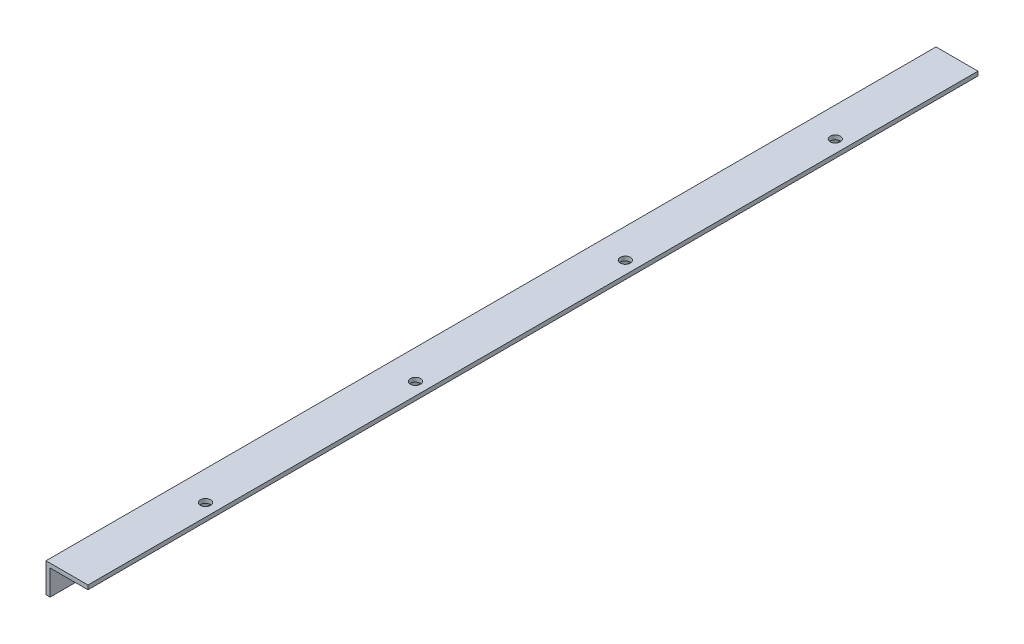
ISO-10303-21;
HEADER;
FILE_DESCRIPTION(('STEP AP214'),'2;1');
FILE_NAME('part.step','',(''),(''),'','','');
FILE_SCHEMA(('AUTOMOTIVE_DESIGN { 1 0 10303 214 1 1 1 1 }'));
ENDSEC;
DATA;
#1=APPLICATION_CONTEXT('core data for automotive mechanical design processes');
#2=APPLICATION_PROTOCOL_DEFINITION('international standard','automotive_design',2000,#1);
#3=PRODUCT_CONTEXT('',#1,'mechanical');
#4=PRODUCT('Part','Part','',(#3));
#5=PRODUCT_RELATED_PRODUCT_CATEGORY('part','',(#4));
#6=PRODUCT_DEFINITION_FORMATION('','',#4);
#7=PRODUCT_DEFINITION_CONTEXT('part definition',#1,'design');
#8=PRODUCT_DEFINITION('design','',#6,#7);
#9=PRODUCT_DEFINITION_SHAPE('','',#8);
#10=(LENGTH_UNIT() NAMED_UNIT(*) SI_UNIT(.MILLI.,.METRE.));
#11=(NAMED_UNIT(*) PLANE_ANGLE_UNIT() SI_UNIT($,.RADIAN.));
#12=(NAMED_UNIT(*) SI_UNIT($,.STERADIAN.) SOLID_ANGLE_UNIT());
#13=UNCERTAINTY_MEASURE_WITH_UNIT(LENGTH_MEASURE(1.E-05),#10,'distance_accuracy_value','');
#14=(GEOMETRIC_REPRESENTATION_CONTEXT(3) GLOBAL_UNCERTAINTY_ASSIGNED_CONTEXT((#13)) GLOBAL_UNIT_ASSIGNED_CONTEXT((#10,
#11,#12)) REPRESENTATION_CONTEXT('',''));
#15=CARTESIAN_POINT('',(0.,0.,0.));
#16=DIRECTION('',(0.,0.,1.));
#17=DIRECTION('',(1.,0.,0.));
#18=AXIS2_PLACEMENT_3D('',#15,#16,#17);
#19=CARTESIAN_POINT('',(1.,0.,212.));
#20=DIRECTION('',(0.,1.,0.));
#21=DIRECTION('',(-1.,0.,0.));
#22=AXIS2_PLACEMENT_3D('',#19,#20,#21);
#23=PLANE('',#22);
#24=DIRECTION('',(1.,0.,0.));
#25=VECTOR('',#24,1.);
#26=CARTESIAN_POINT('',(1.,0.,0.));
#27=LINE('',#26,#25);
#28=CARTESIAN_POINT('',(0.,0.,0.));
#29=VERTEX_POINT('',#28);
#30=CARTESIAN_POINT('',(1.,0.,0.));
#31=VERTEX_POINT('',#30);
#32=EDGE_CURVE('E118',#29,#31,#27,.T.);
#33=ORIENTED_EDGE('',*,*,#32,.T.);
#34=DIRECTION('',(0.,0.,-1.));
#35=VECTOR('',#34,1.);
#36=CARTESIAN_POINT('',(1.,0.,212.));
#37=LINE('',#36,#35);
#38=CARTESIAN_POINT('',(1.,0.,212.));
#39=VERTEX_POINT('',#38);
#40=EDGE_CURVE('E11',#39,#31,#37,.T.);
#41=ORIENTED_EDGE('',*,*,#40,.F.);
#42=DIRECTION('',(1.,0.,0.));
#43=VECTOR('',#42,1.);
#44=CARTESIAN_POINT('',(1.,0.,212.));
#45=LINE('',#44,#43);
#46=CARTESIAN_POINT('',(0.,0.,212.));
#47=VERTEX_POINT('',#46);
#48=EDGE_CURVE('E129',#47,#39,#45,.T.);
#49=ORIENTED_EDGE('',*,*,#48,.F.);
#50=DIRECTION('',(0.,0.,-1.));
#51=VECTOR('',#50,1.);
#52=CARTESIAN_POINT('',(0.,0.,212.));
#53=LINE('',#52,#51);
#54=EDGE_CURVE('E114',#47,#29,#53,.T.);
#55=ORIENTED_EDGE('',*,*,#54,.T.);
#56=EDGE_LOOP('',(#33,#41,#49,#55));
#57=FACE_BOUND('',#56,.T.);
#58=ADVANCED_FACE('F34',(#57),#23,.F.);
#59=CARTESIAN_POINT('',(1.,6.,212.));
#60=DIRECTION('',(-1.,0.,0.));
#61=DIRECTION('',(0.,-1.,0.));
#62=AXIS2_PLACEMENT_3D('',#59,#60,#61);
#63=PLANE('',#62);
#64=DIRECTION('',(0.,1.,0.));
#65=VECTOR('',#64,1.);
#66=CARTESIAN_POINT('',(1.,6.,0.));
#67=LINE('',#66,#65);
#68=CARTESIAN_POINT('',(1.,6.,0.));
#69=VERTEX_POINT('',#68);
#70=EDGE_CURVE('E121',#31,#69,#67,.T.);
#71=ORIENTED_EDGE('',*,*,#70,.T.);
#72=DIRECTION('',(0.,0.,-1.));
#73=VECTOR('',#72,1.);
#74=CARTESIAN_POINT('',(1.,6.,212.));
#75=LINE('',#74,#73);
#76=CARTESIAN_POINT('',(1.,6.,212.));
#77=VERTEX_POINT('',#76);
#78=EDGE_CURVE('E42',#77,#69,#75,.T.);
#79=ORIENTED_EDGE('',*,*,#78,.F.);
#80=DIRECTION('',(0.,1.,0.));
#81=VECTOR('',#80,1.);
#82=CARTESIAN_POINT('',(1.,6.,212.));
#83=LINE('',#82,#81);
#84=EDGE_CURVE('E87',#39,#77,#83,.T.);
#85=ORIENTED_EDGE('',*,*,#84,.F.);
#86=ORIENTED_EDGE('',*,*,#40,.T.);
#87=EDGE_LOOP('',(#71,#79,#85,#86));
#88=FACE_BOUND('',#87,.T.);
#89=ADVANCED_FACE('F154',(#88),#63,.F.);
#90=CARTESIAN_POINT('',(10.,6.,212.));
#91=DIRECTION('',(0.,1.,0.));
#92=DIRECTION('',(-1.,0.,0.));
#93=AXIS2_PLACEMENT_3D('',#90,#91,#92);
#94=PLANE('',#93);
#95=CARTESIAN_POINT('',(7.,6.,131.));
#96=DIRECTION('',(0.,1.,0.));
#97=DIRECTION('',(-1.,0.,0.));
#98=AXIS2_PLACEMENT_3D('',#95,#96,#97);
#99=CIRCLE('',#98,1.2);
#100=CARTESIAN_POINT('',(5.8,6.,131.));
#101=VERTEX_POINT('',#100);
#102=EDGE_CURVE('E242',#101,#101,#99,.T.);
#103=ORIENTED_EDGE('',*,*,#102,.T.);
#104=EDGE_LOOP('',(#103));
#105=FACE_BOUND('',#104,.T.);
#106=CARTESIAN_POINT('',(7.,6.,81.));
#107=DIRECTION('',(0.,1.,0.));
#108=DIRECTION('',(-1.,0.,0.));
#109=AXIS2_PLACEMENT_3D('',#106,#107,#108);
#110=CIRCLE('',#109,1.2);
#111=CARTESIAN_POINT('',(5.8,6.,81.));
#112=VERTEX_POINT('',#111);
#113=EDGE_CURVE('E246',#112,#112,#110,.T.);
#114=ORIENTED_EDGE('',*,*,#113,.T.);
#115=EDGE_LOOP('',(#114));
#116=FACE_BOUND('',#115,.T.);
#117=CARTESIAN_POINT('',(7.,6.,31.));
#118=DIRECTION('',(0.,1.,0.));
#119=DIRECTION('',(-1.,0.,0.));
#120=AXIS2_PLACEMENT_3D('',#117,#118,#119);
#121=CIRCLE('',#120,1.2);
#122=CARTESIAN_POINT('',(5.8,6.,31.));
#123=VERTEX_POINT('',#122);
#124=EDGE_CURVE('E255',#123,#123,#121,.T.);
#125=ORIENTED_EDGE('',*,*,#124,.T.);
#126=EDGE_LOOP('',(#125));
#127=FACE_BOUND('',#126,.T.);
#128=CARTESIAN_POINT('',(7.,6.,181.));
#129=DIRECTION('',(0.,1.,0.));
#130=DIRECTION('',(-1.,0.,0.));
#131=AXIS2_PLACEMENT_3D('',#128,#129,#130);
#132=CIRCLE('',#131,1.2);
#133=CARTESIAN_POINT('',(5.8,6.,181.));
#134=VERTEX_POINT('',#133);
#135=EDGE_CURVE('E122',#134,#134,#132,.T.);
#136=ORIENTED_EDGE('',*,*,#135,.T.);
#137=EDGE_LOOP('',(#136));
#138=FACE_BOUND('',#137,.T.);
#139=DIRECTION('',(1.,0.,0.));
#140=VECTOR('',#139,1.);
#141=CARTESIAN_POINT('',(10.,6.,0.));
#142=LINE('',#141,#140);
#143=CARTESIAN_POINT('',(10.,6.,0.));
#144=VERTEX_POINT('',#143);
#145=EDGE_CURVE('E124',#69,#144,#142,.T.);
#146=ORIENTED_EDGE('',*,*,#145,.T.);
#147=DIRECTION('',(0.,0.,-1.));
#148=VECTOR('',#147,1.);
#149=CARTESIAN_POINT('',(10.,6.,212.));
#150=LINE('',#149,#148);
#151=CARTESIAN_POINT('',(10.,6.,212.));
#152=VERTEX_POINT('',#151);
#153=EDGE_CURVE('E109',#152,#144,#150,.T.);
#154=ORIENTED_EDGE('',*,*,#153,.F.);
#155=DIRECTION('',(1.,0.,0.));
#156=VECTOR('',#155,1.);
#157=CARTESIAN_POINT('',(10.,6.,212.));
#158=LINE('',#157,#156);
#159=EDGE_CURVE('E100',#77,#152,#158,.T.);
#160=ORIENTED_EDGE('',*,*,#159,.F.);
#161=ORIENTED_EDGE('',*,*,#78,.T.);
#162=EDGE_LOOP('',(#146,#154,#160,#161));
#163=FACE_BOUND('',#162,.T.);
#164=ADVANCED_FACE('F135',(#105,#116,#127,#138,#163),#94,.F.);
#165=CARTESIAN_POINT('',(10.,7.,212.));
#166=DIRECTION('',(-1.,0.,0.));
#167=DIRECTION('',(0.,0.,1.));
#168=AXIS2_PLACEMENT_3D('',#165,#166,#167);
#169=PLANE('',#168);
#170=DIRECTION('',(0.,1.,0.));
#171=VECTOR('',#170,1.);
#172=CARTESIAN_POINT('',(10.,7.,0.));
#173=LINE('',#172,#171);
#174=CARTESIAN_POINT('',(10.,7.,0.));
#175=VERTEX_POINT('',#174);
#176=EDGE_CURVE('E108',#144,#175,#173,.T.);
#177=ORIENTED_EDGE('',*,*,#176,.T.);
#178=DIRECTION('',(0.,0.,-1.));
#179=VECTOR('',#178,1.);
#180=CARTESIAN_POINT('',(10.,7.,212.));
#181=LINE('',#180,#179);
#182=CARTESIAN_POINT('',(10.,7.,212.));
#183=VERTEX_POINT('',#182);
#184=EDGE_CURVE('E105',#183,#175,#181,.T.);
#185=ORIENTED_EDGE('',*,*,#184,.F.);
#186=DIRECTION('',(0.,1.,0.));
#187=VECTOR('',#186,1.);
#188=CARTESIAN_POINT('',(10.,7.,212.));
#189=LINE('',#188,#187);
#190=EDGE_CURVE('E94',#152,#183,#189,.T.);
#191=ORIENTED_EDGE('',*,*,#190,.F.);
#192=ORIENTED_EDGE('',*,*,#153,.T.);
#193=EDGE_LOOP('',(#177,#185,#191,#192));
#194=FACE_BOUND('',#193,.T.);
#195=ADVANCED_FACE('F106',(#194),#169,.F.);
#196=CARTESIAN_POINT('',(0.,7.,212.));
#197=DIRECTION('',(0.,-1.,0.));
#198=DIRECTION('',(0.,0.,-1.));
#199=AXIS2_PLACEMENT_3D('',#196,#197,#198);
#200=PLANE('',#199);
#201=CARTESIAN_POINT('',(7.,7.,131.));
#202=DIRECTION('',(0.,1.,0.));
#203=DIRECTION('',(0.,0.,1.));
#204=AXIS2_PLACEMENT_3D('',#201,#202,#203);
#205=CIRCLE('',#204,1.2);
#206=CARTESIAN_POINT('',(7.,7.,132.2));
#207=VERTEX_POINT('',#206);
#208=EDGE_CURVE('E239',#207,#207,#205,.T.);
#209=ORIENTED_EDGE('',*,*,#208,.F.);
#210=EDGE_LOOP('',(#209));
#211=FACE_BOUND('',#210,.T.);
#212=CARTESIAN_POINT('',(7.,7.,81.));
#213=DIRECTION('',(0.,1.,0.));
#214=DIRECTION('',(0.,0.,1.));
#215=AXIS2_PLACEMENT_3D('',#212,#213,#214);
#216=CIRCLE('',#215,1.2);
#217=CARTESIAN_POINT('',(7.,7.,82.2));
#218=VERTEX_POINT('',#217);
#219=EDGE_CURVE('E243',#218,#218,#216,.T.);
#220=ORIENTED_EDGE('',*,*,#219,.F.);
#221=EDGE_LOOP('',(#220));
#222=FACE_BOUND('',#221,.T.);
#223=CARTESIAN_POINT('',(7.,7.,31.));
#224=DIRECTION('',(0.,1.,0.));
#225=DIRECTION('',(0.,0.,1.));
#226=AXIS2_PLACEMENT_3D('',#223,#224,#225);
#227=CIRCLE('',#226,1.2);
#228=CARTESIAN_POINT('',(7.,7.,32.2));
#229=VERTEX_POINT('',#228);
#230=EDGE_CURVE('E252',#229,#229,#227,.T.);
#231=ORIENTED_EDGE('',*,*,#230,.F.);
#232=EDGE_LOOP('',(#231));
#233=FACE_BOUND('',#232,.T.);
#234=CARTESIAN_POINT('',(7.,7.,181.));
#235=DIRECTION('',(0.,1.,0.));
#236=DIRECTION('',(0.,0.,1.));
#237=AXIS2_PLACEMENT_3D('',#234,#235,#236);
#238=CIRCLE('',#237,1.2);
#239=CARTESIAN_POINT('',(7.,7.,182.2));
#240=VERTEX_POINT('',#239);
#241=EDGE_CURVE('E258',#240,#240,#238,.T.);
#242=ORIENTED_EDGE('',*,*,#241,.F.);
#243=EDGE_LOOP('',(#242));
#244=FACE_BOUND('',#243,.T.);
#245=DIRECTION('',(-1.,0.,0.));
#246=VECTOR('',#245,1.);
#247=CARTESIAN_POINT('',(0.,7.,0.));
#248=LINE('',#247,#246);
#249=CARTESIAN_POINT('',(0.,7.,0.));
#250=VERTEX_POINT('',#249);
#251=EDGE_CURVE('E73',#175,#250,#248,.T.);
#252=ORIENTED_EDGE('',*,*,#251,.T.);
#253=DIRECTION('',(0.,0.,-1.));
#254=VECTOR('',#253,1.);
#255=CARTESIAN_POINT('',(0.,7.,212.));
#256=LINE('',#255,#254);
#257=CARTESIAN_POINT('',(0.,7.,212.));
#258=VERTEX_POINT('',#257);
#259=EDGE_CURVE('E110',#258,#250,#256,.T.);
#260=ORIENTED_EDGE('',*,*,#259,.F.);
#261=DIRECTION('',(-1.,0.,0.));
#262=VECTOR('',#261,1.);
#263=CARTESIAN_POINT('',(0.,7.,212.));
#264=LINE('',#263,#262);
#265=EDGE_CURVE('E98',#183,#258,#264,.T.);
#266=ORIENTED_EDGE('',*,*,#265,.F.);
#267=ORIENTED_EDGE('',*,*,#184,.T.);
#268=EDGE_LOOP('',(#252,#260,#266,#267));
#269=FACE_BOUND('',#268,.T.);
#270=ADVANCED_FACE('F112',(#211,#222,#233,#244,#269),#200,.F.);
#271=CARTESIAN_POINT('',(0.,0.,212.));
#272=DIRECTION('',(1.,0.,0.));
#273=DIRECTION('',(0.,0.,-1.));
#274=AXIS2_PLACEMENT_3D('',#271,#272,#273);
#275=PLANE('',#274);
#276=DIRECTION('',(0.,-1.,0.));
#277=VECTOR('',#276,1.);
#278=CARTESIAN_POINT('',(0.,0.,0.));
#279=LINE('',#278,#277);
#280=EDGE_CURVE('E79',#250,#29,#279,.T.);
#281=ORIENTED_EDGE('',*,*,#280,.T.);
#282=ORIENTED_EDGE('',*,*,#54,.F.);
#283=DIRECTION('',(0.,-1.,0.));
#284=VECTOR('',#283,1.);
#285=CARTESIAN_POINT('',(0.,0.,212.));
#286=LINE('',#285,#284);
#287=EDGE_CURVE('E50',#258,#47,#286,.T.);
#288=ORIENTED_EDGE('',*,*,#287,.F.);
#289=ORIENTED_EDGE('',*,*,#259,.T.);
#290=EDGE_LOOP('',(#281,#282,#288,#289));
#291=FACE_BOUND('',#290,.T.);
#292=ADVANCED_FACE('F142',(#291),#275,.F.);
#293=CARTESIAN_POINT('',(0.,0.,212.));
#294=DIRECTION('',(0.,0.,-1.));
#295=DIRECTION('',(-1.,0.,0.));
#296=AXIS2_PLACEMENT_3D('',#293,#294,#295);
#297=PLANE('',#296);
#298=ORIENTED_EDGE('',*,*,#48,.T.);
#299=ORIENTED_EDGE('',*,*,#84,.T.);
#300=ORIENTED_EDGE('',*,*,#159,.T.);
#301=ORIENTED_EDGE('',*,*,#190,.T.);
#302=ORIENTED_EDGE('',*,*,#265,.T.);
#303=ORIENTED_EDGE('',*,*,#287,.T.);
#304=EDGE_LOOP('',(#298,#299,#300,#301,#302,#303));
#305=FACE_BOUND('',#304,.T.);
#306=ADVANCED_FACE('F96',(#305),#297,.F.);
#307=CARTESIAN_POINT('',(0.,0.,0.));
#308=DIRECTION('',(0.,0.,-1.));
#309=DIRECTION('',(-1.,0.,0.));
#310=AXIS2_PLACEMENT_3D('',#307,#308,#309);
#311=PLANE('',#310);
#312=ORIENTED_EDGE('',*,*,#32,.F.);
#313=ORIENTED_EDGE('',*,*,#280,.F.);
#314=ORIENTED_EDGE('',*,*,#251,.F.);
#315=ORIENTED_EDGE('',*,*,#176,.F.);
#316=ORIENTED_EDGE('',*,*,#145,.F.);
#317=ORIENTED_EDGE('',*,*,#70,.F.);
#318=EDGE_LOOP('',(#312,#313,#314,#315,#316,#317));
#319=FACE_BOUND('',#318,.T.);
#320=ADVANCED_FACE('F138',(#319),#311,.T.);
#321=CARTESIAN_POINT('',(7.,7.,181.));
#322=DIRECTION('',(0.,1.,0.));
#323=DIRECTION('',(0.,0.,1.));
#324=AXIS2_PLACEMENT_3D('',#321,#322,#323);
#325=CYLINDRICAL_SURFACE('',#324,1.2);
#326=ORIENTED_EDGE('',*,*,#241,.T.);
#327=EDGE_LOOP('',(#326));
#328=FACE_BOUND('',#327,.T.);
#329=ORIENTED_EDGE('',*,*,#135,.F.);
#330=EDGE_LOOP('',(#329));
#331=FACE_BOUND('',#330,.T.);
#332=ADVANCED_FACE('F182',(#328,#331),#325,.F.);
#333=CARTESIAN_POINT('',(7.,7.,31.));
#334=DIRECTION('',(0.,1.,0.));
#335=DIRECTION('',(0.,0.,1.));
#336=AXIS2_PLACEMENT_3D('',#333,#334,#335);
#337=CYLINDRICAL_SURFACE('',#336,1.2);
#338=ORIENTED_EDGE('',*,*,#230,.T.);
#339=EDGE_LOOP('',(#338));
#340=FACE_BOUND('',#339,.T.);
#341=ORIENTED_EDGE('',*,*,#124,.F.);
#342=EDGE_LOOP('',(#341));
#343=FACE_BOUND('',#342,.T.);
#344=ADVANCED_FACE('F187',(#340,#343),#337,.F.);
#345=CARTESIAN_POINT('',(7.,7.,81.));
#346=DIRECTION('',(0.,1.,0.));
#347=DIRECTION('',(0.,0.,1.));
#348=AXIS2_PLACEMENT_3D('',#345,#346,#347);
#349=CYLINDRICAL_SURFACE('',#348,1.2);
#350=ORIENTED_EDGE('',*,*,#219,.T.);
#351=EDGE_LOOP('',(#350));
#352=FACE_BOUND('',#351,.T.);
#353=ORIENTED_EDGE('',*,*,#113,.F.);
#354=EDGE_LOOP('',(#353));
#355=FACE_BOUND('',#354,.T.);
#356=ADVANCED_FACE('F199',(#352,#355),#349,.F.);
#357=CARTESIAN_POINT('',(7.,7.,131.));
#358=DIRECTION('',(0.,1.,0.));
#359=DIRECTION('',(0.,0.,1.));
#360=AXIS2_PLACEMENT_3D('',#357,#358,#359);
#361=CYLINDRICAL_SURFACE('',#360,1.2);
#362=ORIENTED_EDGE('',*,*,#208,.T.);
#363=EDGE_LOOP('',(#362));
#364=FACE_BOUND('',#363,.T.);
#365=ORIENTED_EDGE('',*,*,#102,.F.);
#366=EDGE_LOOP('',(#365));
#367=FACE_BOUND('',#366,.T.);
#368=ADVANCED_FACE('F209',(#364,#367),#361,.F.);
#369=CLOSED_SHELL('',(#58,#89,#164,#195,#270,#292,#306,#320,#332,#344,#356,#368));
#370=MANIFOLD_SOLID_BREP('B2',#369);
#371=ADVANCED_BREP_SHAPE_REPRESENTATION('',(#18,#370),#14);
#372=SHAPE_DEFINITION_REPRESENTATION(#9,#371);
ENDSEC;
END-ISO-10303-21;
